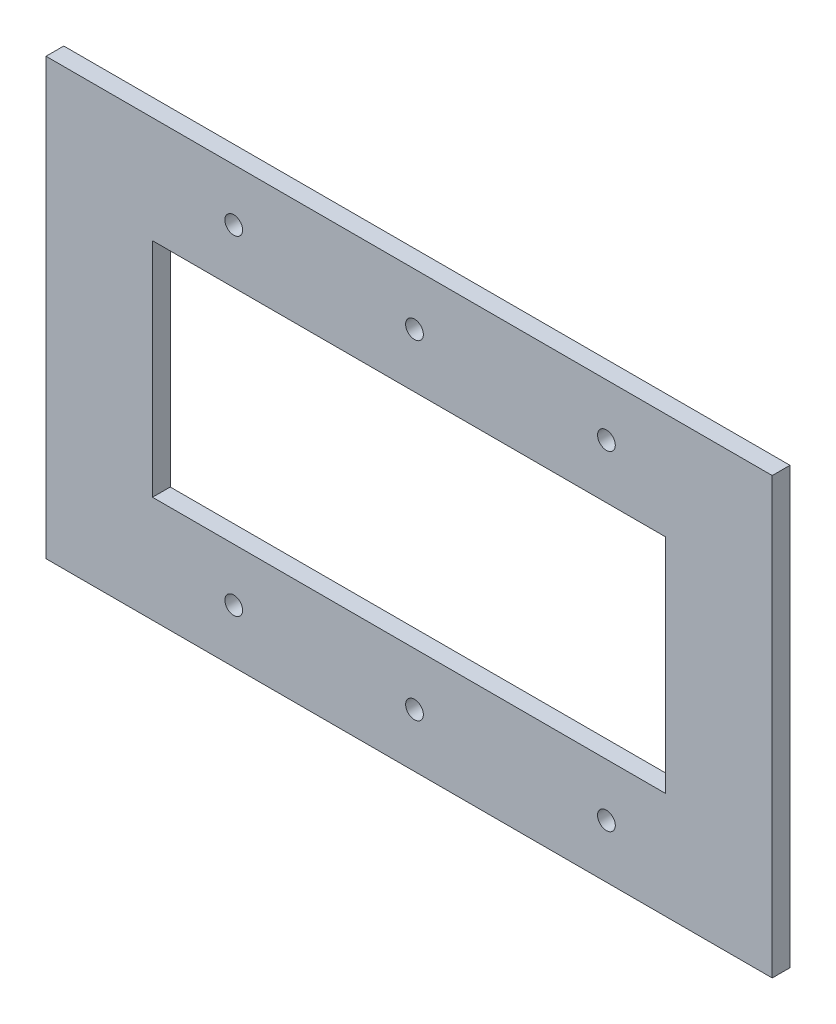
ISO-10303-21;
HEADER;
FILE_DESCRIPTION(('STEP AP214'),'2;1');
FILE_NAME('part.step','',(''),(''),'','','');
FILE_SCHEMA(('AUTOMOTIVE_DESIGN { 1 0 10303 214 1 1 1 1 }'));
ENDSEC;
DATA;
#1=APPLICATION_CONTEXT('core data for automotive mechanical design processes');
#2=APPLICATION_PROTOCOL_DEFINITION('international standard','automotive_design',2000,#1);
#3=PRODUCT_CONTEXT('',#1,'mechanical');
#4=PRODUCT('Part','Part','',(#3));
#5=PRODUCT_RELATED_PRODUCT_CATEGORY('part','',(#4));
#6=PRODUCT_DEFINITION_FORMATION('','',#4);
#7=PRODUCT_DEFINITION_CONTEXT('part definition',#1,'design');
#8=PRODUCT_DEFINITION('design','',#6,#7);
#9=PRODUCT_DEFINITION_SHAPE('','',#8);
#10=(LENGTH_UNIT() NAMED_UNIT(*) SI_UNIT(.MILLI.,.METRE.));
#11=(NAMED_UNIT(*) PLANE_ANGLE_UNIT() SI_UNIT($,.RADIAN.));
#12=(NAMED_UNIT(*) SI_UNIT($,.STERADIAN.) SOLID_ANGLE_UNIT());
#13=UNCERTAINTY_MEASURE_WITH_UNIT(LENGTH_MEASURE(1.E-05),#10,'distance_accuracy_value','');
#14=(GEOMETRIC_REPRESENTATION_CONTEXT(3) GLOBAL_UNCERTAINTY_ASSIGNED_CONTEXT((#13)) GLOBAL_UNIT_ASSIGNED_CONTEXT((#10,
#11,#12)) REPRESENTATION_CONTEXT('',''));
#15=CARTESIAN_POINT('',(0.,0.,0.));
#16=DIRECTION('',(0.,0.,1.));
#17=DIRECTION('',(1.,0.,0.));
#18=AXIS2_PLACEMENT_3D('',#15,#16,#17);
#19=CARTESIAN_POINT('',(0.,0.,6.35));
#20=DIRECTION('',(0.,0.,1.));
#21=DIRECTION('',(1.,0.,0.));
#22=AXIS2_PLACEMENT_3D('',#19,#20,#21);
#23=PLANE('',#22);
#24=CARTESIAN_POINT('',(29.0675403733472,98.9074551366533,6.35));
#25=DIRECTION('',(0.,0.,1.));
#26=DIRECTION('',(1.,0.,0.));
#27=AXIS2_PLACEMENT_3D('',#24,#25,#26);
#28=CIRCLE('',#27,3.17499999999998);
#29=CARTESIAN_POINT('',(32.2425403733472,98.9074551366533,6.35));
#30=VERTEX_POINT('',#29);
#31=EDGE_CURVE('E245',#30,#30,#28,.T.);
#32=ORIENTED_EDGE('',*,*,#31,.F.);
#33=EDGE_LOOP('',(#32));
#34=FACE_BOUND('',#33,.T.);
#35=CARTESIAN_POINT('',(93.7403195951458,98.9074551366533,6.35));
#36=DIRECTION('',(0.,0.,1.));
#37=DIRECTION('',(1.,0.,0.));
#38=AXIS2_PLACEMENT_3D('',#35,#36,#37);
#39=CIRCLE('',#38,3.17499999999998);
#40=CARTESIAN_POINT('',(96.9153195951458,98.9074551366533,6.35));
#41=VERTEX_POINT('',#40);
#42=EDGE_CURVE('E247',#41,#41,#39,.T.);
#43=ORIENTED_EDGE('',*,*,#42,.F.);
#44=EDGE_LOOP('',(#43));
#45=FACE_BOUND('',#44,.T.);
#46=CARTESIAN_POINT('',(162.414380137729,98.9074551366533,6.35));
#47=DIRECTION('',(0.,0.,1.));
#48=DIRECTION('',(1.,0.,0.));
#49=AXIS2_PLACEMENT_3D('',#46,#47,#48);
#50=CIRCLE('',#49,3.17499999999998);
#51=CARTESIAN_POINT('',(165.589380137729,98.9074551366533,6.35));
#52=VERTEX_POINT('',#51);
#53=EDGE_CURVE('E255',#52,#52,#50,.T.);
#54=ORIENTED_EDGE('',*,*,#53,.F.);
#55=EDGE_LOOP('',(#54));
#56=FACE_BOUND('',#55,.T.);
#57=CARTESIAN_POINT('',(162.414380137729,-18.9163523143497,6.35));
#58=DIRECTION('',(0.,0.,1.));
#59=DIRECTION('',(1.,0.,0.));
#60=AXIS2_PLACEMENT_3D('',#57,#58,#59);
#61=CIRCLE('',#60,3.17499999999998);
#62=CARTESIAN_POINT('',(165.589380137729,-18.9163523143497,6.35));
#63=VERTEX_POINT('',#62);
#64=EDGE_CURVE('E261',#63,#63,#61,.T.);
#65=ORIENTED_EDGE('',*,*,#64,.F.);
#66=EDGE_LOOP('',(#65));
#67=FACE_BOUND('',#66,.T.);
#68=CARTESIAN_POINT('',(93.7403195951458,-18.9163523143497,6.35));
#69=DIRECTION('',(0.,0.,1.));
#70=DIRECTION('',(1.,0.,0.));
#71=AXIS2_PLACEMENT_3D('',#68,#69,#70);
#72=CIRCLE('',#71,3.17499999999998);
#73=CARTESIAN_POINT('',(96.9153195951458,-18.9163523143497,6.35));
#74=VERTEX_POINT('',#73);
#75=EDGE_CURVE('E267',#74,#74,#72,.T.);
#76=ORIENTED_EDGE('',*,*,#75,.F.);
#77=EDGE_LOOP('',(#76));
#78=FACE_BOUND('',#77,.T.);
#79=CARTESIAN_POINT('',(29.0675403733472,-18.9163523143497,6.35));
#80=DIRECTION('',(0.,0.,1.));
#81=DIRECTION('',(1.,0.,0.));
#82=AXIS2_PLACEMENT_3D('',#79,#80,#81);
#83=CIRCLE('',#82,3.17499999999998);
#84=CARTESIAN_POINT('',(32.2425403733472,-18.9163523143497,6.35));
#85=VERTEX_POINT('',#84);
#86=EDGE_CURVE('E273',#85,#85,#83,.T.);
#87=ORIENTED_EDGE('',*,*,#86,.F.);
#88=EDGE_LOOP('',(#87));
#89=FACE_BOUND('',#88,.T.);
#90=DIRECTION('',(0.,1.,0.));
#91=VECTOR('',#90,1.);
#92=CARTESIAN_POINT('',(221.742,117.602,6.35));
#93=LINE('',#92,#91);
#94=CARTESIAN_POINT('',(221.742,-38.1,6.35));
#95=VERTEX_POINT('',#94);
#96=CARTESIAN_POINT('',(221.742,117.602,6.35));
#97=VERTEX_POINT('',#96);
#98=EDGE_CURVE('E135',#95,#97,#93,.T.);
#99=ORIENTED_EDGE('',*,*,#98,.T.);
#100=DIRECTION('',(-1.,0.,0.));
#101=VECTOR('',#100,1.);
#102=CARTESIAN_POINT('',(-38.1,117.602,6.35));
#103=LINE('',#102,#101);
#104=CARTESIAN_POINT('',(-38.1,117.602,6.35));
#105=VERTEX_POINT('',#104);
#106=EDGE_CURVE('E138',#97,#105,#103,.T.);
#107=ORIENTED_EDGE('',*,*,#106,.T.);
#108=DIRECTION('',(0.,-1.,0.));
#109=VECTOR('',#108,1.);
#110=CARTESIAN_POINT('',(-38.1,117.602,6.35));
#111=LINE('',#110,#109);
#112=CARTESIAN_POINT('',(-38.1,-38.1,6.35));
#113=VERTEX_POINT('',#112);
#114=EDGE_CURVE('E141',#105,#113,#111,.T.);
#115=ORIENTED_EDGE('',*,*,#114,.T.);
#116=DIRECTION('',(1.,0.,0.));
#117=VECTOR('',#116,1.);
#118=CARTESIAN_POINT('',(-38.1,-38.1,6.35));
#119=LINE('',#118,#117);
#120=EDGE_CURVE('E143',#113,#95,#119,.T.);
#121=ORIENTED_EDGE('',*,*,#120,.T.);
#122=EDGE_LOOP('',(#99,#107,#115,#121));
#123=FACE_BOUND('',#122,.T.);
#124=DIRECTION('',(1.,0.,0.));
#125=VECTOR('',#124,1.);
#126=CARTESIAN_POINT('',(0.,0.,6.35));
#127=LINE('',#126,#125);
#128=CARTESIAN_POINT('',(0.,0.,6.35));
#129=VERTEX_POINT('',#128);
#130=CARTESIAN_POINT('',(183.642,0.,6.35));
#131=VERTEX_POINT('',#130);
#132=EDGE_CURVE('E105',#129,#131,#127,.T.);
#133=ORIENTED_EDGE('',*,*,#132,.F.);
#134=DIRECTION('',(0.,-1.,0.));
#135=VECTOR('',#134,1.);
#136=CARTESIAN_POINT('',(0.,0.,6.35));
#137=LINE('',#136,#135);
#138=CARTESIAN_POINT('',(0.,79.502,6.35));
#139=VERTEX_POINT('',#138);
#140=EDGE_CURVE('E97',#139,#129,#137,.T.);
#141=ORIENTED_EDGE('',*,*,#140,.F.);
#142=DIRECTION('',(-1.,0.,0.));
#143=VECTOR('',#142,1.);
#144=CARTESIAN_POINT('',(0.,79.502,6.35));
#145=LINE('',#144,#143);
#146=CARTESIAN_POINT('',(183.642,79.502,6.35));
#147=VERTEX_POINT('',#146);
#148=EDGE_CURVE('E119',#147,#139,#145,.T.);
#149=ORIENTED_EDGE('',*,*,#148,.F.);
#150=DIRECTION('',(0.,1.,0.));
#151=VECTOR('',#150,1.);
#152=CARTESIAN_POINT('',(183.642,0.,6.35));
#153=LINE('',#152,#151);
#154=EDGE_CURVE('E117',#131,#147,#153,.T.);
#155=ORIENTED_EDGE('',*,*,#154,.F.);
#156=EDGE_LOOP('',(#133,#141,#149,#155));
#157=FACE_BOUND('',#156,.T.);
#158=ADVANCED_FACE('F32',(#34,#45,#56,#67,#78,#89,#123,#157),#23,.T.);
#159=CARTESIAN_POINT('',(0.,0.,0.));
#160=DIRECTION('',(0.,0.,1.));
#161=DIRECTION('',(1.,0.,0.));
#162=AXIS2_PLACEMENT_3D('',#159,#160,#161);
#163=PLANE('',#162);
#164=CARTESIAN_POINT('',(29.0675403733472,98.9074551366533,0.));
#165=DIRECTION('',(0.,0.,1.));
#166=DIRECTION('',(1.,0.,0.));
#167=AXIS2_PLACEMENT_3D('',#164,#165,#166);
#168=CIRCLE('',#167,3.175);
#169=CARTESIAN_POINT('',(32.2425403733472,98.9074551366533,0.));
#170=VERTEX_POINT('',#169);
#171=EDGE_CURVE('E243',#170,#170,#168,.T.);
#172=ORIENTED_EDGE('',*,*,#171,.T.);
#173=EDGE_LOOP('',(#172));
#174=FACE_BOUND('',#173,.T.);
#175=CARTESIAN_POINT('',(93.7403195951458,98.9074551366533,0.));
#176=DIRECTION('',(0.,0.,1.));
#177=DIRECTION('',(1.,0.,0.));
#178=AXIS2_PLACEMENT_3D('',#175,#176,#177);
#179=CIRCLE('',#178,3.175);
#180=CARTESIAN_POINT('',(96.9153195951458,98.9074551366533,0.));
#181=VERTEX_POINT('',#180);
#182=EDGE_CURVE('E252',#181,#181,#179,.T.);
#183=ORIENTED_EDGE('',*,*,#182,.T.);
#184=EDGE_LOOP('',(#183));
#185=FACE_BOUND('',#184,.T.);
#186=CARTESIAN_POINT('',(162.414380137729,98.9074551366533,0.));
#187=DIRECTION('',(0.,0.,1.));
#188=DIRECTION('',(1.,0.,0.));
#189=AXIS2_PLACEMENT_3D('',#186,#187,#188);
#190=CIRCLE('',#189,3.17500000000001);
#191=CARTESIAN_POINT('',(165.589380137729,98.9074551366533,0.));
#192=VERTEX_POINT('',#191);
#193=EDGE_CURVE('E258',#192,#192,#190,.T.);
#194=ORIENTED_EDGE('',*,*,#193,.T.);
#195=EDGE_LOOP('',(#194));
#196=FACE_BOUND('',#195,.T.);
#197=CARTESIAN_POINT('',(162.414380137729,-18.9163523143497,0.));
#198=DIRECTION('',(0.,0.,1.));
#199=DIRECTION('',(1.,0.,0.));
#200=AXIS2_PLACEMENT_3D('',#197,#198,#199);
#201=CIRCLE('',#200,3.17500000000001);
#202=CARTESIAN_POINT('',(165.589380137729,-18.9163523143497,0.));
#203=VERTEX_POINT('',#202);
#204=EDGE_CURVE('E264',#203,#203,#201,.T.);
#205=ORIENTED_EDGE('',*,*,#204,.T.);
#206=EDGE_LOOP('',(#205));
#207=FACE_BOUND('',#206,.T.);
#208=CARTESIAN_POINT('',(93.7403195951458,-18.9163523143497,0.));
#209=DIRECTION('',(0.,0.,1.));
#210=DIRECTION('',(1.,0.,0.));
#211=AXIS2_PLACEMENT_3D('',#208,#209,#210);
#212=CIRCLE('',#211,3.175);
#213=CARTESIAN_POINT('',(96.9153195951458,-18.9163523143497,0.));
#214=VERTEX_POINT('',#213);
#215=EDGE_CURVE('E270',#214,#214,#212,.T.);
#216=ORIENTED_EDGE('',*,*,#215,.T.);
#217=EDGE_LOOP('',(#216));
#218=FACE_BOUND('',#217,.T.);
#219=CARTESIAN_POINT('',(29.0675403733472,-18.9163523143497,0.));
#220=DIRECTION('',(0.,0.,1.));
#221=DIRECTION('',(1.,0.,0.));
#222=AXIS2_PLACEMENT_3D('',#219,#220,#221);
#223=CIRCLE('',#222,3.175);
#224=CARTESIAN_POINT('',(32.2425403733472,-18.9163523143497,0.));
#225=VERTEX_POINT('',#224);
#226=EDGE_CURVE('E125',#225,#225,#223,.T.);
#227=ORIENTED_EDGE('',*,*,#226,.T.);
#228=EDGE_LOOP('',(#227));
#229=FACE_BOUND('',#228,.T.);
#230=DIRECTION('',(0.,1.,0.));
#231=VECTOR('',#230,1.);
#232=CARTESIAN_POINT('',(221.742,117.602,0.));
#233=LINE('',#232,#231);
#234=CARTESIAN_POINT('',(221.742,-38.1,0.));
#235=VERTEX_POINT('',#234);
#236=CARTESIAN_POINT('',(221.742,117.602,0.));
#237=VERTEX_POINT('',#236);
#238=EDGE_CURVE('E113',#235,#237,#233,.T.);
#239=ORIENTED_EDGE('',*,*,#238,.F.);
#240=DIRECTION('',(1.,0.,0.));
#241=VECTOR('',#240,1.);
#242=CARTESIAN_POINT('',(-38.1,-38.1,0.));
#243=LINE('',#242,#241);
#244=CARTESIAN_POINT('',(-38.1,-38.1,0.));
#245=VERTEX_POINT('',#244);
#246=EDGE_CURVE('E139',#245,#235,#243,.T.);
#247=ORIENTED_EDGE('',*,*,#246,.F.);
#248=DIRECTION('',(0.,-1.,0.));
#249=VECTOR('',#248,1.);
#250=CARTESIAN_POINT('',(-38.1,117.602,0.));
#251=LINE('',#250,#249);
#252=CARTESIAN_POINT('',(-38.1,117.602,0.));
#253=VERTEX_POINT('',#252);
#254=EDGE_CURVE('E150',#253,#245,#251,.T.);
#255=ORIENTED_EDGE('',*,*,#254,.F.);
#256=DIRECTION('',(-1.,0.,0.));
#257=VECTOR('',#256,1.);
#258=CARTESIAN_POINT('',(-38.1,117.602,0.));
#259=LINE('',#258,#257);
#260=EDGE_CURVE('E148',#237,#253,#259,.T.);
#261=ORIENTED_EDGE('',*,*,#260,.F.);
#262=EDGE_LOOP('',(#239,#247,#255,#261));
#263=FACE_BOUND('',#262,.T.);
#264=DIRECTION('',(0.,-1.,0.));
#265=VECTOR('',#264,1.);
#266=CARTESIAN_POINT('',(0.,0.,0.));
#267=LINE('',#266,#265);
#268=CARTESIAN_POINT('',(0.,79.502,0.));
#269=VERTEX_POINT('',#268);
#270=CARTESIAN_POINT('',(0.,0.,0.));
#271=VERTEX_POINT('',#270);
#272=EDGE_CURVE('E55',#269,#271,#267,.T.);
#273=ORIENTED_EDGE('',*,*,#272,.T.);
#274=DIRECTION('',(1.,0.,0.));
#275=VECTOR('',#274,1.);
#276=CARTESIAN_POINT('',(0.,0.,0.));
#277=LINE('',#276,#275);
#278=CARTESIAN_POINT('',(183.642,0.,0.));
#279=VERTEX_POINT('',#278);
#280=EDGE_CURVE('E112',#271,#279,#277,.T.);
#281=ORIENTED_EDGE('',*,*,#280,.T.);
#282=DIRECTION('',(0.,1.,0.));
#283=VECTOR('',#282,1.);
#284=CARTESIAN_POINT('',(183.642,0.,0.));
#285=LINE('',#284,#283);
#286=CARTESIAN_POINT('',(183.642,79.502,0.));
#287=VERTEX_POINT('',#286);
#288=EDGE_CURVE('E127',#279,#287,#285,.T.);
#289=ORIENTED_EDGE('',*,*,#288,.T.);
#290=DIRECTION('',(-1.,0.,0.));
#291=VECTOR('',#290,1.);
#292=CARTESIAN_POINT('',(0.,79.502,0.));
#293=LINE('',#292,#291);
#294=EDGE_CURVE('E106',#287,#269,#293,.T.);
#295=ORIENTED_EDGE('',*,*,#294,.T.);
#296=EDGE_LOOP('',(#273,#281,#289,#295));
#297=FACE_BOUND('',#296,.T.);
#298=ADVANCED_FACE('F168',(#174,#185,#196,#207,#218,#229,#263,#297),#163,.F.);
#299=CARTESIAN_POINT('',(221.742,117.602,6.35));
#300=DIRECTION('',(-1.,0.,0.));
#301=DIRECTION('',(0.,-1.,0.));
#302=AXIS2_PLACEMENT_3D('',#299,#300,#301);
#303=PLANE('',#302);
#304=ORIENTED_EDGE('',*,*,#238,.T.);
#305=DIRECTION('',(0.,0.,-1.));
#306=VECTOR('',#305,1.);
#307=CARTESIAN_POINT('',(221.742,117.602,6.35));
#308=LINE('',#307,#306);
#309=EDGE_CURVE('E11',#97,#237,#308,.T.);
#310=ORIENTED_EDGE('',*,*,#309,.F.);
#311=ORIENTED_EDGE('',*,*,#98,.F.);
#312=DIRECTION('',(0.,0.,-1.));
#313=VECTOR('',#312,1.);
#314=CARTESIAN_POINT('',(221.742,-38.1,6.35));
#315=LINE('',#314,#313);
#316=EDGE_CURVE('E145',#95,#235,#315,.T.);
#317=ORIENTED_EDGE('',*,*,#316,.T.);
#318=EDGE_LOOP('',(#304,#310,#311,#317));
#319=FACE_BOUND('',#318,.T.);
#320=ADVANCED_FACE('F34',(#319),#303,.F.);
#321=CARTESIAN_POINT('',(-38.1,117.602,6.35));
#322=DIRECTION('',(0.,-1.,0.));
#323=DIRECTION('',(0.,0.,-1.));
#324=AXIS2_PLACEMENT_3D('',#321,#322,#323);
#325=PLANE('',#324);
#326=ORIENTED_EDGE('',*,*,#260,.T.);
#327=DIRECTION('',(0.,0.,-1.));
#328=VECTOR('',#327,1.);
#329=CARTESIAN_POINT('',(-38.1,117.602,6.35));
#330=LINE('',#329,#328);
#331=EDGE_CURVE('E40',#105,#253,#330,.T.);
#332=ORIENTED_EDGE('',*,*,#331,.F.);
#333=ORIENTED_EDGE('',*,*,#106,.F.);
#334=ORIENTED_EDGE('',*,*,#309,.T.);
#335=EDGE_LOOP('',(#326,#332,#333,#334));
#336=FACE_BOUND('',#335,.T.);
#337=ADVANCED_FACE('F178',(#336),#325,.F.);
#338=CARTESIAN_POINT('',(-38.1,117.602,6.35));
#339=DIRECTION('',(1.,0.,0.));
#340=DIRECTION('',(0.,1.,0.));
#341=AXIS2_PLACEMENT_3D('',#338,#339,#340);
#342=PLANE('',#341);
#343=ORIENTED_EDGE('',*,*,#254,.T.);
#344=DIRECTION('',(0.,0.,-1.));
#345=VECTOR('',#344,1.);
#346=CARTESIAN_POINT('',(-38.1,-38.1,6.35));
#347=LINE('',#346,#345);
#348=EDGE_CURVE('E155',#113,#245,#347,.T.);
#349=ORIENTED_EDGE('',*,*,#348,.F.);
#350=ORIENTED_EDGE('',*,*,#114,.F.);
#351=ORIENTED_EDGE('',*,*,#331,.T.);
#352=EDGE_LOOP('',(#343,#349,#350,#351));
#353=FACE_BOUND('',#352,.T.);
#354=ADVANCED_FACE('F162',(#353),#342,.F.);
#355=CARTESIAN_POINT('',(-38.1,-38.1,6.35));
#356=DIRECTION('',(0.,1.,0.));
#357=DIRECTION('',(0.,0.,1.));
#358=AXIS2_PLACEMENT_3D('',#355,#356,#357);
#359=PLANE('',#358);
#360=ORIENTED_EDGE('',*,*,#246,.T.);
#361=ORIENTED_EDGE('',*,*,#316,.F.);
#362=ORIENTED_EDGE('',*,*,#120,.F.);
#363=ORIENTED_EDGE('',*,*,#348,.T.);
#364=EDGE_LOOP('',(#360,#361,#362,#363));
#365=FACE_BOUND('',#364,.T.);
#366=ADVANCED_FACE('F172',(#365),#359,.F.);
#367=CARTESIAN_POINT('',(0.,0.,6.35));
#368=DIRECTION('',(1.,0.,0.));
#369=DIRECTION('',(0.,0.,-1.));
#370=AXIS2_PLACEMENT_3D('',#367,#368,#369);
#371=PLANE('',#370);
#372=ORIENTED_EDGE('',*,*,#272,.F.);
#373=DIRECTION('',(0.,0.,-1.));
#374=VECTOR('',#373,1.);
#375=CARTESIAN_POINT('',(0.,79.502,6.35));
#376=LINE('',#375,#374);
#377=EDGE_CURVE('E101',#139,#269,#376,.T.);
#378=ORIENTED_EDGE('',*,*,#377,.F.);
#379=ORIENTED_EDGE('',*,*,#140,.T.);
#380=DIRECTION('',(0.,0.,-1.));
#381=VECTOR('',#380,1.);
#382=CARTESIAN_POINT('',(0.,0.,6.35));
#383=LINE('',#382,#381);
#384=EDGE_CURVE('E100',#129,#271,#383,.T.);
#385=ORIENTED_EDGE('',*,*,#384,.T.);
#386=EDGE_LOOP('',(#372,#378,#379,#385));
#387=FACE_BOUND('',#386,.T.);
#388=ADVANCED_FACE('F99',(#387),#371,.T.);
#389=CARTESIAN_POINT('',(0.,0.,6.35));
#390=DIRECTION('',(0.,1.,0.));
#391=DIRECTION('',(0.,0.,1.));
#392=AXIS2_PLACEMENT_3D('',#389,#390,#391);
#393=PLANE('',#392);
#394=ORIENTED_EDGE('',*,*,#280,.F.);
#395=ORIENTED_EDGE('',*,*,#384,.F.);
#396=ORIENTED_EDGE('',*,*,#132,.T.);
#397=DIRECTION('',(0.,0.,-1.));
#398=VECTOR('',#397,1.);
#399=CARTESIAN_POINT('',(183.642,0.,6.35));
#400=LINE('',#399,#398);
#401=EDGE_CURVE('E114',#131,#279,#400,.T.);
#402=ORIENTED_EDGE('',*,*,#401,.T.);
#403=EDGE_LOOP('',(#394,#395,#396,#402));
#404=FACE_BOUND('',#403,.T.);
#405=ADVANCED_FACE('F109',(#404),#393,.T.);
#406=CARTESIAN_POINT('',(183.642,0.,6.35));
#407=DIRECTION('',(-1.,0.,0.));
#408=DIRECTION('',(0.,0.,1.));
#409=AXIS2_PLACEMENT_3D('',#406,#407,#408);
#410=PLANE('',#409);
#411=ORIENTED_EDGE('',*,*,#288,.F.);
#412=ORIENTED_EDGE('',*,*,#401,.F.);
#413=ORIENTED_EDGE('',*,*,#154,.T.);
#414=DIRECTION('',(0.,0.,-1.));
#415=VECTOR('',#414,1.);
#416=CARTESIAN_POINT('',(183.642,79.502,6.35));
#417=LINE('',#416,#415);
#418=EDGE_CURVE('E47',#147,#287,#417,.T.);
#419=ORIENTED_EDGE('',*,*,#418,.T.);
#420=EDGE_LOOP('',(#411,#412,#413,#419));
#421=FACE_BOUND('',#420,.T.);
#422=ADVANCED_FACE('F205',(#421),#410,.T.);
#423=CARTESIAN_POINT('',(0.,79.502,6.35));
#424=DIRECTION('',(0.,-1.,0.));
#425=DIRECTION('',(0.,0.,-1.));
#426=AXIS2_PLACEMENT_3D('',#423,#424,#425);
#427=PLANE('',#426);
#428=ORIENTED_EDGE('',*,*,#294,.F.);
#429=ORIENTED_EDGE('',*,*,#418,.F.);
#430=ORIENTED_EDGE('',*,*,#148,.T.);
#431=ORIENTED_EDGE('',*,*,#377,.T.);
#432=EDGE_LOOP('',(#428,#429,#430,#431));
#433=FACE_BOUND('',#432,.T.);
#434=ADVANCED_FACE('F209',(#433),#427,.T.);
#435=CARTESIAN_POINT('',(29.0675403733472,-18.9163523143497,6.35));
#436=DIRECTION('',(0.,0.,1.));
#437=DIRECTION('',(1.,0.,0.));
#438=AXIS2_PLACEMENT_3D('',#435,#436,#437);
#439=CYLINDRICAL_SURFACE('',#438,3.17499999999999);
#440=ORIENTED_EDGE('',*,*,#226,.F.);
#441=EDGE_LOOP('',(#440));
#442=FACE_BOUND('',#441,.T.);
#443=ORIENTED_EDGE('',*,*,#86,.T.);
#444=EDGE_LOOP('',(#443));
#445=FACE_BOUND('',#444,.T.);
#446=ADVANCED_FACE('F215',(#442,#445),#439,.F.);
#447=CARTESIAN_POINT('',(93.7403195951458,-18.9163523143497,6.35));
#448=DIRECTION('',(0.,0.,1.));
#449=DIRECTION('',(1.,0.,0.));
#450=AXIS2_PLACEMENT_3D('',#447,#448,#449);
#451=CYLINDRICAL_SURFACE('',#450,3.17499999999999);
#452=ORIENTED_EDGE('',*,*,#215,.F.);
#453=EDGE_LOOP('',(#452));
#454=FACE_BOUND('',#453,.T.);
#455=ORIENTED_EDGE('',*,*,#75,.T.);
#456=EDGE_LOOP('',(#455));
#457=FACE_BOUND('',#456,.T.);
#458=ADVANCED_FACE('F218',(#454,#457),#451,.F.);
#459=CARTESIAN_POINT('',(162.414380137729,-18.9163523143497,6.35));
#460=DIRECTION('',(0.,0.,1.));
#461=DIRECTION('',(1.,0.,0.));
#462=AXIS2_PLACEMENT_3D('',#459,#460,#461);
#463=CYLINDRICAL_SURFACE('',#462,3.175);
#464=ORIENTED_EDGE('',*,*,#204,.F.);
#465=EDGE_LOOP('',(#464));
#466=FACE_BOUND('',#465,.T.);
#467=ORIENTED_EDGE('',*,*,#64,.T.);
#468=EDGE_LOOP('',(#467));
#469=FACE_BOUND('',#468,.T.);
#470=ADVANCED_FACE('F222',(#466,#469),#463,.F.);
#471=CARTESIAN_POINT('',(162.414380137729,98.9074551366533,6.35));
#472=DIRECTION('',(0.,0.,1.));
#473=DIRECTION('',(1.,0.,0.));
#474=AXIS2_PLACEMENT_3D('',#471,#472,#473);
#475=CYLINDRICAL_SURFACE('',#474,3.175);
#476=ORIENTED_EDGE('',*,*,#193,.F.);
#477=EDGE_LOOP('',(#476));
#478=FACE_BOUND('',#477,.T.);
#479=ORIENTED_EDGE('',*,*,#53,.T.);
#480=EDGE_LOOP('',(#479));
#481=FACE_BOUND('',#480,.T.);
#482=ADVANCED_FACE('F226',(#478,#481),#475,.F.);
#483=CARTESIAN_POINT('',(93.7403195951458,98.9074551366533,6.35));
#484=DIRECTION('',(0.,0.,1.));
#485=DIRECTION('',(1.,0.,0.));
#486=AXIS2_PLACEMENT_3D('',#483,#484,#485);
#487=CYLINDRICAL_SURFACE('',#486,3.17499999999999);
#488=ORIENTED_EDGE('',*,*,#182,.F.);
#489=EDGE_LOOP('',(#488));
#490=FACE_BOUND('',#489,.T.);
#491=ORIENTED_EDGE('',*,*,#42,.T.);
#492=EDGE_LOOP('',(#491));
#493=FACE_BOUND('',#492,.T.);
#494=ADVANCED_FACE('F230',(#490,#493),#487,.F.);
#495=CARTESIAN_POINT('',(29.0675403733472,98.9074551366533,6.35));
#496=DIRECTION('',(0.,0.,1.));
#497=DIRECTION('',(1.,0.,0.));
#498=AXIS2_PLACEMENT_3D('',#495,#496,#497);
#499=CYLINDRICAL_SURFACE('',#498,3.17499999999999);
#500=ORIENTED_EDGE('',*,*,#171,.F.);
#501=EDGE_LOOP('',(#500));
#502=FACE_BOUND('',#501,.T.);
#503=ORIENTED_EDGE('',*,*,#31,.T.);
#504=EDGE_LOOP('',(#503));
#505=FACE_BOUND('',#504,.T.);
#506=ADVANCED_FACE('F234',(#502,#505),#499,.F.);
#507=CLOSED_SHELL('',(#158,#298,#320,#337,#354,#366,#388,#405,#422,#434,#446,#458,#470,#482,
#494,#506));
#508=MANIFOLD_SOLID_BREP('B2',#507);
#509=ADVANCED_BREP_SHAPE_REPRESENTATION('',(#18,#508),#14);
#510=SHAPE_DEFINITION_REPRESENTATION(#9,#509);
ENDSEC;
END-ISO-10303-21;
